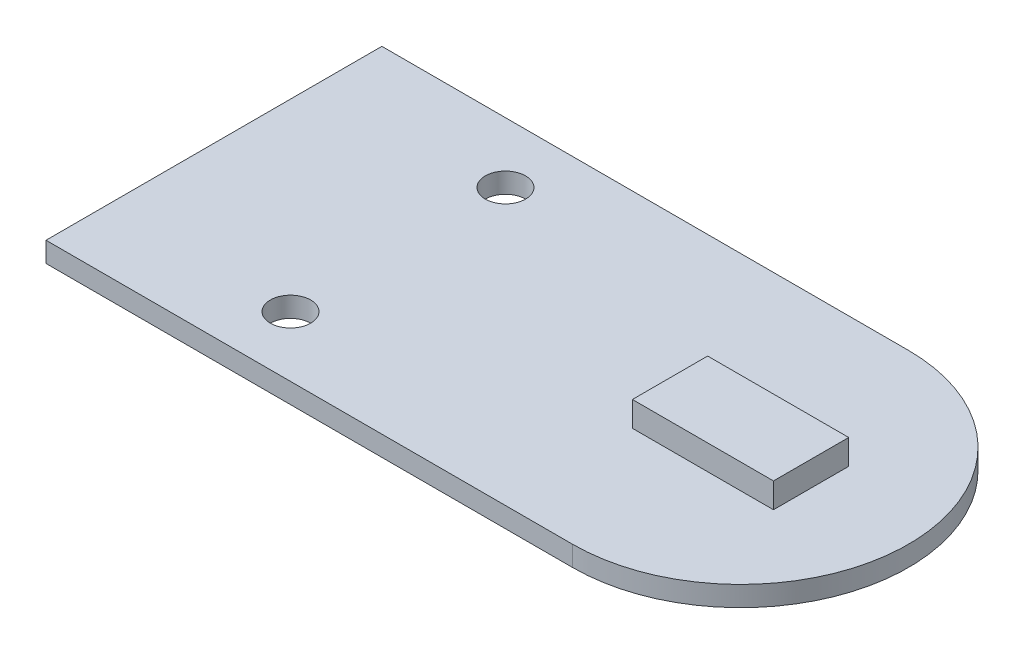
ISO-10303-21;
HEADER;
FILE_DESCRIPTION(('STEP AP214'),'2;1');
FILE_NAME('part.step','',(''),(''),'','','');
FILE_SCHEMA(('AUTOMOTIVE_DESIGN { 1 0 10303 214 1 1 1 1 }'));
ENDSEC;
DATA;
#1=APPLICATION_CONTEXT('core data for automotive mechanical design processes');
#2=APPLICATION_PROTOCOL_DEFINITION('international standard','automotive_design',2000,#1);
#3=PRODUCT_CONTEXT('',#1,'mechanical');
#4=PRODUCT('Part','Part','',(#3));
#5=PRODUCT_RELATED_PRODUCT_CATEGORY('part','',(#4));
#6=PRODUCT_DEFINITION_FORMATION('','',#4);
#7=PRODUCT_DEFINITION_CONTEXT('part definition',#1,'design');
#8=PRODUCT_DEFINITION('design','',#6,#7);
#9=PRODUCT_DEFINITION_SHAPE('','',#8);
#10=(LENGTH_UNIT() NAMED_UNIT(*) SI_UNIT(.MILLI.,.METRE.));
#11=(NAMED_UNIT(*) PLANE_ANGLE_UNIT() SI_UNIT($,.RADIAN.));
#12=(NAMED_UNIT(*) SI_UNIT($,.STERADIAN.) SOLID_ANGLE_UNIT());
#13=UNCERTAINTY_MEASURE_WITH_UNIT(LENGTH_MEASURE(1.E-05),#10,'distance_accuracy_value','');
#14=(GEOMETRIC_REPRESENTATION_CONTEXT(3) GLOBAL_UNCERTAINTY_ASSIGNED_CONTEXT((#13)) GLOBAL_UNIT_ASSIGNED_CONTEXT((#10,
#11,#12)) REPRESENTATION_CONTEXT('',''));
#15=CARTESIAN_POINT('',(0.,0.,0.));
#16=DIRECTION('',(0.,0.,1.));
#17=DIRECTION('',(1.,0.,0.));
#18=AXIS2_PLACEMENT_3D('',#15,#16,#17);
#19=CARTESIAN_POINT('',(0.,1.5,0.));
#20=DIRECTION('',(0.,1.,0.));
#21=DIRECTION('',(0.,0.,1.));
#22=AXIS2_PLACEMENT_3D('',#19,#20,#21);
#23=PLANE('',#22);
#24=CARTESIAN_POINT('',(-25.5,1.5,-7.99999999999999));
#25=DIRECTION('',(0.,1.,0.));
#26=DIRECTION('',(0.,0.,1.));
#27=AXIS2_PLACEMENT_3D('',#24,#25,#26);
#28=CIRCLE('',#27,1.5);
#29=CARTESIAN_POINT('',(-25.5,1.5,-6.49999999999999));
#30=VERTEX_POINT('',#29);
#31=EDGE_CURVE('E161',#30,#30,#28,.T.);
#32=ORIENTED_EDGE('',*,*,#31,.F.);
#33=EDGE_LOOP('',(#32));
#34=FACE_BOUND('',#33,.T.);
#35=DIRECTION('',(0.,0.,1.));
#36=VECTOR('',#35,1.);
#37=CARTESIAN_POINT('',(-39.2,1.5,-12.5));
#38=LINE('',#37,#36);
#39=CARTESIAN_POINT('',(-39.2,1.5,-12.5));
#40=VERTEX_POINT('',#39);
#41=CARTESIAN_POINT('',(-39.2,1.5,12.5));
#42=VERTEX_POINT('',#41);
#43=EDGE_CURVE('E169',#40,#42,#38,.T.);
#44=ORIENTED_EDGE('',*,*,#43,.T.);
#45=DIRECTION('',(1.,0.,0.));
#46=VECTOR('',#45,1.);
#47=CARTESIAN_POINT('',(-39.2,1.5,12.5));
#48=LINE('',#47,#46);
#49=CARTESIAN_POINT('',(0.,1.5,12.5));
#50=VERTEX_POINT('',#49);
#51=EDGE_CURVE('E101',#42,#50,#48,.T.);
#52=ORIENTED_EDGE('',*,*,#51,.T.);
#53=CARTESIAN_POINT('',(0.,1.5,0.));
#54=DIRECTION('',(0.,1.,0.));
#55=DIRECTION('',(0.,0.,1.));
#56=AXIS2_PLACEMENT_3D('',#53,#54,#55);
#57=CIRCLE('',#56,12.5);
#58=CARTESIAN_POINT('',(0.,1.5,-12.5));
#59=VERTEX_POINT('',#58);
#60=EDGE_CURVE('E172',#50,#59,#57,.T.);
#61=ORIENTED_EDGE('',*,*,#60,.T.);
#62=DIRECTION('',(-1.,0.,0.));
#63=VECTOR('',#62,1.);
#64=CARTESIAN_POINT('',(-39.2,1.5,-12.5));
#65=LINE('',#64,#63);
#66=EDGE_CURVE('E73',#59,#40,#65,.T.);
#67=ORIENTED_EDGE('',*,*,#66,.T.);
#68=EDGE_LOOP('',(#44,#52,#61,#67));
#69=FACE_BOUND('',#68,.T.);
#70=CARTESIAN_POINT('',(-25.5,1.5,7.99999999999999));
#71=DIRECTION('',(0.,1.,0.));
#72=DIRECTION('',(0.,0.,-1.));
#73=AXIS2_PLACEMENT_3D('',#70,#71,#72);
#74=CIRCLE('',#73,1.5);
#75=CARTESIAN_POINT('',(-25.5,1.5,6.49999999999999));
#76=VERTEX_POINT('',#75);
#77=EDGE_CURVE('E152',#76,#76,#74,.T.);
#78=ORIENTED_EDGE('',*,*,#77,.F.);
#79=EDGE_LOOP('',(#78));
#80=FACE_BOUND('',#79,.T.);
#81=DIRECTION('',(-1.,0.,0.));
#82=VECTOR('',#81,1.);
#83=CARTESIAN_POINT('',(-5.25,1.5,-2.8));
#84=LINE('',#83,#82);
#85=CARTESIAN_POINT('',(5.25,1.5,-2.8));
#86=VERTEX_POINT('',#85);
#87=CARTESIAN_POINT('',(-5.25,1.5,-2.8));
#88=VERTEX_POINT('',#87);
#89=EDGE_CURVE('E346',#86,#88,#84,.T.);
#90=ORIENTED_EDGE('',*,*,#89,.F.);
#91=DIRECTION('',(0.,0.,-1.));
#92=VECTOR('',#91,1.);
#93=CARTESIAN_POINT('',(5.25,1.5,-2.8));
#94=LINE('',#93,#92);
#95=CARTESIAN_POINT('',(5.25,1.5,2.8));
#96=VERTEX_POINT('',#95);
#97=EDGE_CURVE('E146',#96,#86,#94,.T.);
#98=ORIENTED_EDGE('',*,*,#97,.F.);
#99=DIRECTION('',(1.,0.,0.));
#100=VECTOR('',#99,1.);
#101=CARTESIAN_POINT('',(-5.25,1.5,2.8));
#102=LINE('',#101,#100);
#103=CARTESIAN_POINT('',(-5.25,1.5,2.8));
#104=VERTEX_POINT('',#103);
#105=EDGE_CURVE('E142',#104,#96,#102,.T.);
#106=ORIENTED_EDGE('',*,*,#105,.F.);
#107=DIRECTION('',(0.,0.,1.));
#108=VECTOR('',#107,1.);
#109=CARTESIAN_POINT('',(-5.25,1.5,-2.8));
#110=LINE('',#109,#108);
#111=EDGE_CURVE('E343',#88,#104,#110,.T.);
#112=ORIENTED_EDGE('',*,*,#111,.F.);
#113=EDGE_LOOP('',(#90,#98,#106,#112));
#114=FACE_BOUND('',#113,.T.);
#115=ADVANCED_FACE('F49',(#34,#69,#80,#114),#23,.T.);
#116=CARTESIAN_POINT('',(0.,0.,0.));
#117=DIRECTION('',(0.,1.,0.));
#118=DIRECTION('',(0.,0.,1.));
#119=AXIS2_PLACEMENT_3D('',#116,#117,#118);
#120=PLANE('',#119);
#121=DIRECTION('',(0.,0.,1.));
#122=VECTOR('',#121,1.);
#123=CARTESIAN_POINT('',(-39.2,0.,-12.5));
#124=LINE('',#123,#122);
#125=CARTESIAN_POINT('',(-39.2,0.,-12.5));
#126=VERTEX_POINT('',#125);
#127=CARTESIAN_POINT('',(-39.2,0.,12.5));
#128=VERTEX_POINT('',#127);
#129=EDGE_CURVE('E165',#126,#128,#124,.T.);
#130=ORIENTED_EDGE('',*,*,#129,.F.);
#131=DIRECTION('',(-1.,0.,0.));
#132=VECTOR('',#131,1.);
#133=CARTESIAN_POINT('',(-39.2,0.,-12.5));
#134=LINE('',#133,#132);
#135=CARTESIAN_POINT('',(0.,0.,-12.5));
#136=VERTEX_POINT('',#135);
#137=EDGE_CURVE('E94',#136,#126,#134,.T.);
#138=ORIENTED_EDGE('',*,*,#137,.F.);
#139=CARTESIAN_POINT('',(0.,0.,0.));
#140=DIRECTION('',(0.,1.,0.));
#141=DIRECTION('',(0.,0.,1.));
#142=AXIS2_PLACEMENT_3D('',#139,#140,#141);
#143=CIRCLE('',#142,12.5);
#144=CARTESIAN_POINT('',(0.,0.,12.5));
#145=VERTEX_POINT('',#144);
#146=EDGE_CURVE('E180',#145,#136,#143,.T.);
#147=ORIENTED_EDGE('',*,*,#146,.F.);
#148=DIRECTION('',(1.,0.,0.));
#149=VECTOR('',#148,1.);
#150=CARTESIAN_POINT('',(-39.2,0.,12.5));
#151=LINE('',#150,#149);
#152=EDGE_CURVE('E178',#128,#145,#151,.T.);
#153=ORIENTED_EDGE('',*,*,#152,.F.);
#154=EDGE_LOOP('',(#130,#138,#147,#153));
#155=FACE_BOUND('',#154,.T.);
#156=CARTESIAN_POINT('',(-25.5,0.,-7.99999999999999));
#157=DIRECTION('',(0.,1.,0.));
#158=DIRECTION('',(0.,0.,1.));
#159=AXIS2_PLACEMENT_3D('',#156,#157,#158);
#160=CIRCLE('',#159,1.5);
#161=CARTESIAN_POINT('',(-25.5,0.,-6.49999999999999));
#162=VERTEX_POINT('',#161);
#163=EDGE_CURVE('E159',#162,#162,#160,.T.);
#164=ORIENTED_EDGE('',*,*,#163,.T.);
#165=EDGE_LOOP('',(#164));
#166=FACE_BOUND('',#165,.T.);
#167=CARTESIAN_POINT('',(-25.5,0.,7.99999999999999));
#168=DIRECTION('',(0.,1.,0.));
#169=DIRECTION('',(0.,0.,-1.));
#170=AXIS2_PLACEMENT_3D('',#167,#168,#169);
#171=CIRCLE('',#170,1.5);
#172=CARTESIAN_POINT('',(-25.5,0.,6.49999999999999));
#173=VERTEX_POINT('',#172);
#174=EDGE_CURVE('E148',#173,#173,#171,.T.);
#175=ORIENTED_EDGE('',*,*,#174,.T.);
#176=EDGE_LOOP('',(#175));
#177=FACE_BOUND('',#176,.T.);
#178=ADVANCED_FACE('F193',(#155,#166,#177),#120,.F.);
#179=CARTESIAN_POINT('',(-39.2,1.5,-12.5));
#180=DIRECTION('',(1.,0.,0.));
#181=DIRECTION('',(0.,0.,-1.));
#182=AXIS2_PLACEMENT_3D('',#179,#180,#181);
#183=PLANE('',#182);
#184=ORIENTED_EDGE('',*,*,#129,.T.);
#185=DIRECTION('',(0.,-1.,0.));
#186=VECTOR('',#185,1.);
#187=CARTESIAN_POINT('',(-39.2,1.5,12.5));
#188=LINE('',#187,#186);
#189=EDGE_CURVE('E11',#42,#128,#188,.T.);
#190=ORIENTED_EDGE('',*,*,#189,.F.);
#191=ORIENTED_EDGE('',*,*,#43,.F.);
#192=DIRECTION('',(0.,-1.,0.));
#193=VECTOR('',#192,1.);
#194=CARTESIAN_POINT('',(-39.2,1.5,-12.5));
#195=LINE('',#194,#193);
#196=EDGE_CURVE('E175',#40,#126,#195,.T.);
#197=ORIENTED_EDGE('',*,*,#196,.T.);
#198=EDGE_LOOP('',(#184,#190,#191,#197));
#199=FACE_BOUND('',#198,.T.);
#200=ADVANCED_FACE('F51',(#199),#183,.F.);
#201=CARTESIAN_POINT('',(-39.2,1.5,12.5));
#202=DIRECTION('',(0.,0.,-1.));
#203=DIRECTION('',(-1.,0.,0.));
#204=AXIS2_PLACEMENT_3D('',#201,#202,#203);
#205=PLANE('',#204);
#206=ORIENTED_EDGE('',*,*,#152,.T.);
#207=DIRECTION('',(0.,-1.,0.));
#208=VECTOR('',#207,1.);
#209=CARTESIAN_POINT('',(0.,1.5,12.5));
#210=LINE('',#209,#208);
#211=EDGE_CURVE('E57',#50,#145,#210,.T.);
#212=ORIENTED_EDGE('',*,*,#211,.F.);
#213=ORIENTED_EDGE('',*,*,#51,.F.);
#214=ORIENTED_EDGE('',*,*,#189,.T.);
#215=EDGE_LOOP('',(#206,#212,#213,#214));
#216=FACE_BOUND('',#215,.T.);
#217=ADVANCED_FACE('F209',(#216),#205,.F.);
#218=CARTESIAN_POINT('',(0.,1.5,0.));
#219=DIRECTION('',(0.,-1.,0.));
#220=DIRECTION('',(0.,0.,-1.));
#221=AXIS2_PLACEMENT_3D('',#218,#219,#220);
#222=CYLINDRICAL_SURFACE('',#221,12.5);
#223=ORIENTED_EDGE('',*,*,#146,.T.);
#224=DIRECTION('',(0.,-1.,0.));
#225=VECTOR('',#224,1.);
#226=CARTESIAN_POINT('',(0.,1.5,-12.5));
#227=LINE('',#226,#225);
#228=EDGE_CURVE('E184',#59,#136,#227,.T.);
#229=ORIENTED_EDGE('',*,*,#228,.F.);
#230=ORIENTED_EDGE('',*,*,#60,.F.);
#231=ORIENTED_EDGE('',*,*,#211,.T.);
#232=EDGE_LOOP('',(#223,#229,#230,#231));
#233=FACE_BOUND('',#232,.T.);
#234=ADVANCED_FACE('F189',(#233),#222,.T.);
#235=CARTESIAN_POINT('',(-39.2,1.5,-12.5));
#236=DIRECTION('',(0.,0.,1.));
#237=DIRECTION('',(1.,0.,0.));
#238=AXIS2_PLACEMENT_3D('',#235,#236,#237);
#239=PLANE('',#238);
#240=ORIENTED_EDGE('',*,*,#137,.T.);
#241=ORIENTED_EDGE('',*,*,#196,.F.);
#242=ORIENTED_EDGE('',*,*,#66,.F.);
#243=ORIENTED_EDGE('',*,*,#228,.T.);
#244=EDGE_LOOP('',(#240,#241,#242,#243));
#245=FACE_BOUND('',#244,.T.);
#246=ADVANCED_FACE('F198',(#245),#239,.F.);
#247=CARTESIAN_POINT('',(-25.5,1.5,-7.99999999999999));
#248=DIRECTION('',(0.,-1.,0.));
#249=DIRECTION('',(0.,0.,-1.));
#250=AXIS2_PLACEMENT_3D('',#247,#248,#249);
#251=CYLINDRICAL_SURFACE('',#250,1.5);
#252=ORIENTED_EDGE('',*,*,#31,.T.);
#253=EDGE_LOOP('',(#252));
#254=FACE_BOUND('',#253,.T.);
#255=ORIENTED_EDGE('',*,*,#163,.F.);
#256=EDGE_LOOP('',(#255));
#257=FACE_BOUND('',#256,.T.);
#258=ADVANCED_FACE('F200',(#254,#257),#251,.F.);
#259=CARTESIAN_POINT('',(-25.5,1.5,7.99999999999999));
#260=DIRECTION('',(0.,-1.,0.));
#261=DIRECTION('',(0.,0.,-1.));
#262=AXIS2_PLACEMENT_3D('',#259,#260,#261);
#263=CYLINDRICAL_SURFACE('',#262,1.5);
#264=ORIENTED_EDGE('',*,*,#77,.T.);
#265=EDGE_LOOP('',(#264));
#266=FACE_BOUND('',#265,.T.);
#267=ORIENTED_EDGE('',*,*,#174,.F.);
#268=EDGE_LOOP('',(#267));
#269=FACE_BOUND('',#268,.T.);
#270=ADVANCED_FACE('F206',(#266,#269),#263,.F.);
#271=CARTESIAN_POINT('',(5.25,3.36,-2.8));
#272=DIRECTION('',(-1.,0.,0.));
#273=DIRECTION('',(0.,0.,1.));
#274=AXIS2_PLACEMENT_3D('',#271,#272,#273);
#275=PLANE('',#274);
#276=ORIENTED_EDGE('',*,*,#97,.T.);
#277=DIRECTION('',(0.,-1.,0.));
#278=VECTOR('',#277,1.);
#279=CARTESIAN_POINT('',(5.25,3.36,-2.8));
#280=LINE('',#279,#278);
#281=CARTESIAN_POINT('',(5.25,3.36,-2.8));
#282=VERTEX_POINT('',#281);
#283=EDGE_CURVE('E127',#282,#86,#280,.T.);
#284=ORIENTED_EDGE('',*,*,#283,.F.);
#285=DIRECTION('',(0.,0.,-1.));
#286=VECTOR('',#285,1.);
#287=CARTESIAN_POINT('',(5.25,3.36,-2.8));
#288=LINE('',#287,#286);
#289=CARTESIAN_POINT('',(5.25,3.36,2.8));
#290=VERTEX_POINT('',#289);
#291=EDGE_CURVE('E134',#290,#282,#288,.T.);
#292=ORIENTED_EDGE('',*,*,#291,.F.);
#293=DIRECTION('',(0.,-1.,0.));
#294=VECTOR('',#293,1.);
#295=CARTESIAN_POINT('',(5.25,3.36,2.8));
#296=LINE('',#295,#294);
#297=EDGE_CURVE('E340',#290,#96,#296,.T.);
#298=ORIENTED_EDGE('',*,*,#297,.T.);
#299=EDGE_LOOP('',(#276,#284,#292,#298));
#300=FACE_BOUND('',#299,.T.);
#301=ADVANCED_FACE('F144',(#300),#275,.F.);
#302=CARTESIAN_POINT('',(-5.25,3.36,-2.8));
#303=DIRECTION('',(0.,0.,1.));
#304=DIRECTION('',(1.,0.,0.));
#305=AXIS2_PLACEMENT_3D('',#302,#303,#304);
#306=PLANE('',#305);
#307=ORIENTED_EDGE('',*,*,#89,.T.);
#308=DIRECTION('',(0.,-1.,0.));
#309=VECTOR('',#308,1.);
#310=CARTESIAN_POINT('',(-5.25,3.36,-2.8));
#311=LINE('',#310,#309);
#312=CARTESIAN_POINT('',(-5.25,3.36,-2.8));
#313=VERTEX_POINT('',#312);
#314=EDGE_CURVE('E130',#313,#88,#311,.T.);
#315=ORIENTED_EDGE('',*,*,#314,.F.);
#316=DIRECTION('',(-1.,0.,0.));
#317=VECTOR('',#316,1.);
#318=CARTESIAN_POINT('',(-5.25,3.36,-2.8));
#319=LINE('',#318,#317);
#320=EDGE_CURVE('E123',#282,#313,#319,.T.);
#321=ORIENTED_EDGE('',*,*,#320,.F.);
#322=ORIENTED_EDGE('',*,*,#283,.T.);
#323=EDGE_LOOP('',(#307,#315,#321,#322));
#324=FACE_BOUND('',#323,.T.);
#325=ADVANCED_FACE('F125',(#324),#306,.F.);
#326=CARTESIAN_POINT('',(-5.25,3.36,-2.8));
#327=DIRECTION('',(1.,0.,0.));
#328=DIRECTION('',(0.,0.,-1.));
#329=AXIS2_PLACEMENT_3D('',#326,#327,#328);
#330=PLANE('',#329);
#331=ORIENTED_EDGE('',*,*,#111,.T.);
#332=DIRECTION('',(0.,-1.,0.));
#333=VECTOR('',#332,1.);
#334=CARTESIAN_POINT('',(-5.25,3.36,2.8));
#335=LINE('',#334,#333);
#336=CARTESIAN_POINT('',(-5.25,3.36,2.8));
#337=VERTEX_POINT('',#336);
#338=EDGE_CURVE('E64',#337,#104,#335,.T.);
#339=ORIENTED_EDGE('',*,*,#338,.F.);
#340=DIRECTION('',(0.,0.,1.));
#341=VECTOR('',#340,1.);
#342=CARTESIAN_POINT('',(-5.25,3.36,-2.8));
#343=LINE('',#342,#341);
#344=EDGE_CURVE('E133',#313,#337,#343,.T.);
#345=ORIENTED_EDGE('',*,*,#344,.F.);
#346=ORIENTED_EDGE('',*,*,#314,.T.);
#347=EDGE_LOOP('',(#331,#339,#345,#346));
#348=FACE_BOUND('',#347,.T.);
#349=ADVANCED_FACE('F227',(#348),#330,.F.);
#350=CARTESIAN_POINT('',(-5.25,3.36,2.8));
#351=DIRECTION('',(0.,0.,-1.));
#352=DIRECTION('',(-1.,0.,0.));
#353=AXIS2_PLACEMENT_3D('',#350,#351,#352);
#354=PLANE('',#353);
#355=ORIENTED_EDGE('',*,*,#105,.T.);
#356=ORIENTED_EDGE('',*,*,#297,.F.);
#357=DIRECTION('',(1.,0.,0.));
#358=VECTOR('',#357,1.);
#359=CARTESIAN_POINT('',(-5.25,3.36,2.8));
#360=LINE('',#359,#358);
#361=EDGE_CURVE('E138',#337,#290,#360,.T.);
#362=ORIENTED_EDGE('',*,*,#361,.F.);
#363=ORIENTED_EDGE('',*,*,#338,.T.);
#364=EDGE_LOOP('',(#355,#356,#362,#363));
#365=FACE_BOUND('',#364,.T.);
#366=ADVANCED_FACE('F230',(#365),#354,.F.);
#367=CARTESIAN_POINT('',(0.,3.36,0.));
#368=DIRECTION('',(0.,1.,0.));
#369=DIRECTION('',(0.,0.,1.));
#370=AXIS2_PLACEMENT_3D('',#367,#368,#369);
#371=PLANE('',#370);
#372=ORIENTED_EDGE('',*,*,#291,.T.);
#373=ORIENTED_EDGE('',*,*,#320,.T.);
#374=ORIENTED_EDGE('',*,*,#344,.T.);
#375=ORIENTED_EDGE('',*,*,#361,.T.);
#376=EDGE_LOOP('',(#372,#373,#374,#375));
#377=FACE_BOUND('',#376,.T.);
#378=ADVANCED_FACE('F137',(#377),#371,.T.);
#379=CLOSED_SHELL('',(#115,#178,#200,#217,#234,#246,#258,#270,#301,#325,#349,#366,#378));
#380=MANIFOLD_SOLID_BREP('B2',#379);
#381=ADVANCED_BREP_SHAPE_REPRESENTATION('',(#18,#380),#14);
#382=SHAPE_DEFINITION_REPRESENTATION(#9,#381);
ENDSEC;
END-ISO-10303-21;
